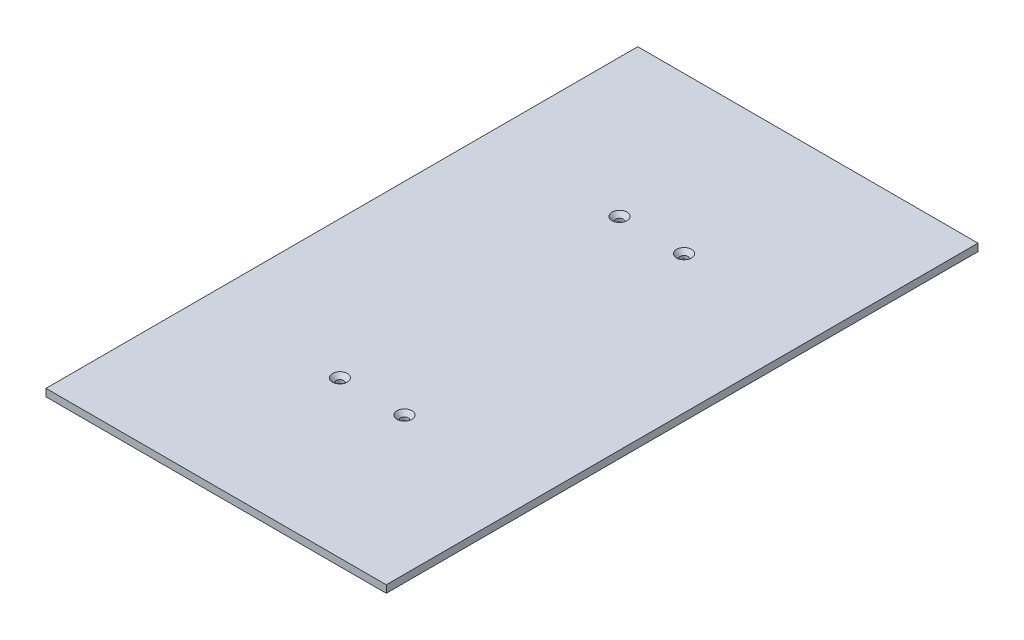
ISO-10303-21;
HEADER;
FILE_DESCRIPTION(('STEP AP214'),'2;1');
FILE_NAME('part.step','',(''),(''),'','','');
FILE_SCHEMA(('AUTOMOTIVE_DESIGN { 1 0 10303 214 1 1 1 1 }'));
ENDSEC;
DATA;
#1=APPLICATION_CONTEXT('core data for automotive mechanical design processes');
#2=APPLICATION_PROTOCOL_DEFINITION('international standard','automotive_design',2000,#1);
#3=PRODUCT_CONTEXT('',#1,'mechanical');
#4=PRODUCT('Part','Part','',(#3));
#5=PRODUCT_RELATED_PRODUCT_CATEGORY('part','',(#4));
#6=PRODUCT_DEFINITION_FORMATION('','',#4);
#7=PRODUCT_DEFINITION_CONTEXT('part definition',#1,'design');
#8=PRODUCT_DEFINITION('design','',#6,#7);
#9=PRODUCT_DEFINITION_SHAPE('','',#8);
#10=(LENGTH_UNIT() NAMED_UNIT(*) SI_UNIT(.MILLI.,.METRE.));
#11=(NAMED_UNIT(*) PLANE_ANGLE_UNIT() SI_UNIT($,.RADIAN.));
#12=(NAMED_UNIT(*) SI_UNIT($,.STERADIAN.) SOLID_ANGLE_UNIT());
#13=UNCERTAINTY_MEASURE_WITH_UNIT(LENGTH_MEASURE(1.E-05),#10,'distance_accuracy_value','');
#14=(GEOMETRIC_REPRESENTATION_CONTEXT(3) GLOBAL_UNCERTAINTY_ASSIGNED_CONTEXT((#13)) GLOBAL_UNIT_ASSIGNED_CONTEXT((#10,
#11,#12)) REPRESENTATION_CONTEXT('',''));
#15=CARTESIAN_POINT('',(0.,0.,0.));
#16=DIRECTION('',(0.,0.,1.));
#17=DIRECTION('',(1.,0.,0.));
#18=AXIS2_PLACEMENT_3D('',#15,#16,#17);
#19=CARTESIAN_POINT('',(0.92717059071068,6.35,22.9951434882447));
#20=DIRECTION('',(0.,0.,-1.));
#21=DIRECTION('',(-1.,0.,0.));
#22=AXIS2_PLACEMENT_3D('',#19,#20,#21);
#23=PLANE('',#22);
#24=DIRECTION('',(1.,0.,0.));
#25=VECTOR('',#24,1.);
#26=CARTESIAN_POINT('',(0.92717059071068,0.,22.9951434882447));
#27=LINE('',#26,#25);
#28=CARTESIAN_POINT('',(0.92717059071068,0.,22.9951434882447));
#29=VERTEX_POINT('',#28);
#30=CARTESIAN_POINT('',(293.027170590711,0.,22.9951434882446));
#31=VERTEX_POINT('',#30);
#32=EDGE_CURVE('E120',#29,#31,#27,.T.);
#33=ORIENTED_EDGE('',*,*,#32,.T.);
#34=DIRECTION('',(0.,-1.,0.));
#35=VECTOR('',#34,1.);
#36=CARTESIAN_POINT('',(293.027170590711,6.35,22.9951434882446));
#37=LINE('',#36,#35);
#38=CARTESIAN_POINT('',(293.027170590711,6.35,22.9951434882446));
#39=VERTEX_POINT('',#38);
#40=EDGE_CURVE('E11',#39,#31,#37,.T.);
#41=ORIENTED_EDGE('',*,*,#40,.F.);
#42=DIRECTION('',(1.,0.,0.));
#43=VECTOR('',#42,1.);
#44=CARTESIAN_POINT('',(0.92717059071068,6.35,22.9951434882447));
#45=LINE('',#44,#43);
#46=CARTESIAN_POINT('',(0.92717059071068,6.35,22.9951434882447));
#47=VERTEX_POINT('',#46);
#48=EDGE_CURVE('E100',#47,#39,#45,.T.);
#49=ORIENTED_EDGE('',*,*,#48,.F.);
#50=DIRECTION('',(0.,-1.,0.));
#51=VECTOR('',#50,1.);
#52=CARTESIAN_POINT('',(0.92717059071068,6.35,22.9951434882447));
#53=LINE('',#52,#51);
#54=EDGE_CURVE('E62',#47,#29,#53,.T.);
#55=ORIENTED_EDGE('',*,*,#54,.T.);
#56=EDGE_LOOP('',(#33,#41,#49,#55));
#57=FACE_BOUND('',#56,.T.);
#58=ADVANCED_FACE('F42',(#57),#23,.F.);
#59=CARTESIAN_POINT('',(293.027170590711,6.35,22.9951434882446));
#60=DIRECTION('',(-1.,0.,0.));
#61=DIRECTION('',(0.,0.,1.));
#62=AXIS2_PLACEMENT_3D('',#59,#60,#61);
#63=PLANE('',#62);
#64=DIRECTION('',(0.,0.,-1.));
#65=VECTOR('',#64,1.);
#66=CARTESIAN_POINT('',(293.027170590711,0.,22.9951434882446));
#67=LINE('',#66,#65);
#68=CARTESIAN_POINT('',(293.027170590711,0.,-485.004856511755));
#69=VERTEX_POINT('',#68);
#70=EDGE_CURVE('E106',#31,#69,#67,.T.);
#71=ORIENTED_EDGE('',*,*,#70,.T.);
#72=DIRECTION('',(0.,-1.,0.));
#73=VECTOR('',#72,1.);
#74=CARTESIAN_POINT('',(293.027170590711,6.35,-485.004856511755));
#75=LINE('',#74,#73);
#76=CARTESIAN_POINT('',(293.027170590711,6.35,-485.004856511755));
#77=VERTEX_POINT('',#76);
#78=EDGE_CURVE('E51',#77,#69,#75,.T.);
#79=ORIENTED_EDGE('',*,*,#78,.F.);
#80=DIRECTION('',(0.,0.,-1.));
#81=VECTOR('',#80,1.);
#82=CARTESIAN_POINT('',(293.027170590711,6.35,22.9951434882446));
#83=LINE('',#82,#81);
#84=EDGE_CURVE('E91',#39,#77,#83,.T.);
#85=ORIENTED_EDGE('',*,*,#84,.F.);
#86=ORIENTED_EDGE('',*,*,#40,.T.);
#87=EDGE_LOOP('',(#71,#79,#85,#86));
#88=FACE_BOUND('',#87,.T.);
#89=ADVANCED_FACE('F105',(#88),#63,.F.);
#90=CARTESIAN_POINT('',(0.92717059071068,6.35,-485.004856511755));
#91=DIRECTION('',(0.,0.,-1.));
#92=DIRECTION('',(-1.,0.,0.));
#93=AXIS2_PLACEMENT_3D('',#90,#91,#92);
#94=PLANE('',#93);
#95=DIRECTION('',(1.,0.,0.));
#96=VECTOR('',#95,1.);
#97=CARTESIAN_POINT('',(0.92717059071068,0.,-485.004856511755));
#98=LINE('',#97,#96);
#99=CARTESIAN_POINT('',(0.92717059071068,0.,-485.004856511755));
#100=VERTEX_POINT('',#99);
#101=EDGE_CURVE('E126',#100,#69,#98,.T.);
#102=ORIENTED_EDGE('',*,*,#101,.F.);
#103=DIRECTION('',(0.,-1.,0.));
#104=VECTOR('',#103,1.);
#105=CARTESIAN_POINT('',(0.92717059071068,6.35,-485.004856511755));
#106=LINE('',#105,#104);
#107=CARTESIAN_POINT('',(0.92717059071068,6.35,-485.004856511755));
#108=VERTEX_POINT('',#107);
#109=EDGE_CURVE('E79',#108,#100,#106,.T.);
#110=ORIENTED_EDGE('',*,*,#109,.F.);
#111=DIRECTION('',(1.,0.,0.));
#112=VECTOR('',#111,1.);
#113=CARTESIAN_POINT('',(0.92717059071068,6.35,-485.004856511755));
#114=LINE('',#113,#112);
#115=EDGE_CURVE('E99',#108,#77,#114,.T.);
#116=ORIENTED_EDGE('',*,*,#115,.T.);
#117=ORIENTED_EDGE('',*,*,#78,.T.);
#118=EDGE_LOOP('',(#102,#110,#116,#117));
#119=FACE_BOUND('',#118,.T.);
#120=ADVANCED_FACE('F110',(#119),#94,.T.);
#121=CARTESIAN_POINT('',(0.92717059071068,6.35,22.9951434882447));
#122=DIRECTION('',(-1.,0.,0.));
#123=DIRECTION('',(0.,0.,1.));
#124=AXIS2_PLACEMENT_3D('',#121,#122,#123);
#125=PLANE('',#124);
#126=DIRECTION('',(0.,0.,-1.));
#127=VECTOR('',#126,1.);
#128=CARTESIAN_POINT('',(0.92717059071068,0.,22.9951434882447));
#129=LINE('',#128,#127);
#130=EDGE_CURVE('E128',#29,#100,#129,.T.);
#131=ORIENTED_EDGE('',*,*,#130,.F.);
#132=ORIENTED_EDGE('',*,*,#54,.F.);
#133=DIRECTION('',(0.,0.,-1.));
#134=VECTOR('',#133,1.);
#135=CARTESIAN_POINT('',(0.92717059071068,6.35,22.9951434882447));
#136=LINE('',#135,#134);
#137=EDGE_CURVE('E112',#47,#108,#136,.T.);
#138=ORIENTED_EDGE('',*,*,#137,.T.);
#139=ORIENTED_EDGE('',*,*,#109,.T.);
#140=EDGE_LOOP('',(#131,#132,#138,#139));
#141=FACE_BOUND('',#140,.T.);
#142=ADVANCED_FACE('F204',(#141),#125,.T.);
#143=CARTESIAN_POINT('',(0.,6.35,0.));
#144=DIRECTION('',(0.,1.,0.));
#145=DIRECTION('',(0.,0.,1.));
#146=AXIS2_PLACEMENT_3D('',#143,#144,#145);
#147=PLANE('',#146);
#148=CARTESIAN_POINT('',(119.277170590711,6.35,-351.004856511755));
#149=DIRECTION('',(0.,1.,0.));
#150=DIRECTION('',(0.,0.,1.));
#151=AXIS2_PLACEMENT_3D('',#148,#149,#150);
#152=CIRCLE('',#151,6.4389);
#153=CARTESIAN_POINT('',(119.277170590711,6.35,-344.565956511755));
#154=VERTEX_POINT('',#153);
#155=EDGE_CURVE('E167',#154,#154,#152,.T.);
#156=ORIENTED_EDGE('',*,*,#155,.F.);
#157=EDGE_LOOP('',(#156));
#158=FACE_BOUND('',#157,.T.);
#159=CARTESIAN_POINT('',(174.677170590711,6.35,-351.004856511755));
#160=DIRECTION('',(0.,1.,0.));
#161=DIRECTION('',(0.,0.,1.));
#162=AXIS2_PLACEMENT_3D('',#159,#160,#161);
#163=CIRCLE('',#162,6.4389);
#164=CARTESIAN_POINT('',(174.677170590711,6.35,-344.565956511755));
#165=VERTEX_POINT('',#164);
#166=EDGE_CURVE('E172',#165,#165,#163,.T.);
#167=ORIENTED_EDGE('',*,*,#166,.F.);
#168=EDGE_LOOP('',(#167));
#169=FACE_BOUND('',#168,.T.);
#170=CARTESIAN_POINT('',(174.677170590711,6.35,-111.004856511755));
#171=DIRECTION('',(0.,1.,0.));
#172=DIRECTION('',(0.,0.,1.));
#173=AXIS2_PLACEMENT_3D('',#170,#171,#172);
#174=CIRCLE('',#173,6.4389);
#175=CARTESIAN_POINT('',(174.677170590711,6.35,-104.565956511755));
#176=VERTEX_POINT('',#175);
#177=EDGE_CURVE('E151',#176,#176,#174,.T.);
#178=ORIENTED_EDGE('',*,*,#177,.F.);
#179=EDGE_LOOP('',(#178));
#180=FACE_BOUND('',#179,.T.);
#181=CARTESIAN_POINT('',(119.277170590711,6.35,-111.004856511755));
#182=DIRECTION('',(0.,1.,0.));
#183=DIRECTION('',(0.,0.,1.));
#184=AXIS2_PLACEMENT_3D('',#181,#182,#183);
#185=CIRCLE('',#184,6.4389);
#186=CARTESIAN_POINT('',(119.277170590711,6.35,-104.565956511755));
#187=VERTEX_POINT('',#186);
#188=EDGE_CURVE('E136',#187,#187,#185,.T.);
#189=ORIENTED_EDGE('',*,*,#188,.F.);
#190=EDGE_LOOP('',(#189));
#191=FACE_BOUND('',#190,.T.);
#192=ORIENTED_EDGE('',*,*,#48,.T.);
#193=ORIENTED_EDGE('',*,*,#84,.T.);
#194=ORIENTED_EDGE('',*,*,#115,.F.);
#195=ORIENTED_EDGE('',*,*,#137,.F.);
#196=EDGE_LOOP('',(#192,#193,#194,#195));
#197=FACE_BOUND('',#196,.T.);
#198=ADVANCED_FACE('F96',(#158,#169,#180,#191,#197),#147,.T.);
#199=CARTESIAN_POINT('',(0.,0.,0.));
#200=DIRECTION('',(0.,1.,0.));
#201=DIRECTION('',(0.,0.,1.));
#202=AXIS2_PLACEMENT_3D('',#199,#200,#201);
#203=PLANE('',#202);
#204=CARTESIAN_POINT('',(119.277170590711,0.,-351.004856511755));
#205=DIRECTION('',(0.,1.,0.));
#206=DIRECTION('',(0.,0.,1.));
#207=AXIS2_PLACEMENT_3D('',#204,#205,#206);
#208=CIRCLE('',#207,3.2639);
#209=CARTESIAN_POINT('',(119.277170590711,0.,-347.740956511755));
#210=VERTEX_POINT('',#209);
#211=EDGE_CURVE('E175',#210,#210,#208,.T.);
#212=ORIENTED_EDGE('',*,*,#211,.T.);
#213=EDGE_LOOP('',(#212));
#214=FACE_BOUND('',#213,.T.);
#215=CARTESIAN_POINT('',(174.677170590711,0.,-351.004856511755));
#216=DIRECTION('',(0.,1.,0.));
#217=DIRECTION('',(0.,0.,1.));
#218=AXIS2_PLACEMENT_3D('',#215,#216,#217);
#219=CIRCLE('',#218,3.26389999999999);
#220=CARTESIAN_POINT('',(174.677170590711,0.,-347.740956511755));
#221=VERTEX_POINT('',#220);
#222=EDGE_CURVE('E157',#221,#221,#219,.T.);
#223=ORIENTED_EDGE('',*,*,#222,.T.);
#224=EDGE_LOOP('',(#223));
#225=FACE_BOUND('',#224,.T.);
#226=CARTESIAN_POINT('',(174.677170590711,0.,-111.004856511755));
#227=DIRECTION('',(0.,1.,0.));
#228=DIRECTION('',(0.,0.,1.));
#229=AXIS2_PLACEMENT_3D('',#226,#227,#228);
#230=CIRCLE('',#229,3.26389999999999);
#231=CARTESIAN_POINT('',(174.677170590711,0.,-107.740956511755));
#232=VERTEX_POINT('',#231);
#233=EDGE_CURVE('E140',#232,#232,#230,.T.);
#234=ORIENTED_EDGE('',*,*,#233,.T.);
#235=EDGE_LOOP('',(#234));
#236=FACE_BOUND('',#235,.T.);
#237=CARTESIAN_POINT('',(119.277170590711,0.,-111.004856511755));
#238=DIRECTION('',(0.,1.,0.));
#239=DIRECTION('',(0.,0.,1.));
#240=AXIS2_PLACEMENT_3D('',#237,#238,#239);
#241=CIRCLE('',#240,3.2639);
#242=CARTESIAN_POINT('',(119.277170590711,0.,-107.740956511755));
#243=VERTEX_POINT('',#242);
#244=EDGE_CURVE('E123',#243,#243,#241,.T.);
#245=ORIENTED_EDGE('',*,*,#244,.T.);
#246=EDGE_LOOP('',(#245));
#247=FACE_BOUND('',#246,.T.);
#248=ORIENTED_EDGE('',*,*,#32,.F.);
#249=ORIENTED_EDGE('',*,*,#130,.T.);
#250=ORIENTED_EDGE('',*,*,#101,.T.);
#251=ORIENTED_EDGE('',*,*,#70,.F.);
#252=EDGE_LOOP('',(#248,#249,#250,#251));
#253=FACE_BOUND('',#252,.T.);
#254=ADVANCED_FACE('F186',(#214,#225,#236,#247,#253),#203,.F.);
#255=CARTESIAN_POINT('',(119.277170590711,6.35,-111.004856511755));
#256=DIRECTION('',(0.,1.,0.));
#257=DIRECTION('',(0.,0.,1.));
#258=AXIS2_PLACEMENT_3D('',#255,#256,#257);
#259=CYLINDRICAL_SURFACE('',#258,3.2639);
#260=ORIENTED_EDGE('',*,*,#244,.F.);
#261=EDGE_LOOP('',(#260));
#262=FACE_BOUND('',#261,.T.);
#263=CARTESIAN_POINT('',(119.277170590711,2.69758030707329,-111.004856511755));
#264=DIRECTION('',(0.,1.,0.));
#265=DIRECTION('',(0.,0.,1.));
#266=AXIS2_PLACEMENT_3D('',#263,#264,#265);
#267=CIRCLE('',#266,3.2639);
#268=CARTESIAN_POINT('',(119.277170590711,2.69758030707329,-107.740956511755));
#269=VERTEX_POINT('',#268);
#270=EDGE_CURVE('E139',#269,#269,#267,.T.);
#271=ORIENTED_EDGE('',*,*,#270,.T.);
#272=EDGE_LOOP('',(#271));
#273=FACE_BOUND('',#272,.T.);
#274=ADVANCED_FACE('F214',(#262,#273),#259,.F.);
#275=CARTESIAN_POINT('',(119.277170590711,6.35,-111.004856511755));
#276=DIRECTION('',(0.,1.,0.));
#277=DIRECTION('',(0.,0.,1.));
#278=AXIS2_PLACEMENT_3D('',#275,#276,#277);
#279=CONICAL_SURFACE('',#278,6.4389,0.715584993317674);
#280=ORIENTED_EDGE('',*,*,#270,.F.);
#281=EDGE_LOOP('',(#280));
#282=FACE_BOUND('',#281,.T.);
#283=ORIENTED_EDGE('',*,*,#188,.T.);
#284=EDGE_LOOP('',(#283));
#285=FACE_BOUND('',#284,.T.);
#286=ADVANCED_FACE('F211',(#282,#285),#279,.F.);
#287=CARTESIAN_POINT('',(174.677170590711,6.35,-111.004856511755));
#288=DIRECTION('',(0.,1.,0.));
#289=DIRECTION('',(0.,0.,1.));
#290=AXIS2_PLACEMENT_3D('',#287,#288,#289);
#291=CYLINDRICAL_SURFACE('',#290,3.26389999999999);
#292=ORIENTED_EDGE('',*,*,#233,.F.);
#293=EDGE_LOOP('',(#292));
#294=FACE_BOUND('',#293,.T.);
#295=CARTESIAN_POINT('',(174.677170590711,2.69758030707329,-111.004856511755));
#296=DIRECTION('',(0.,1.,0.));
#297=DIRECTION('',(0.,0.,1.));
#298=AXIS2_PLACEMENT_3D('',#295,#296,#297);
#299=CIRCLE('',#298,3.26389999999999);
#300=CARTESIAN_POINT('',(174.677170590711,2.69758030707329,-107.740956511755));
#301=VERTEX_POINT('',#300);
#302=EDGE_CURVE('E148',#301,#301,#299,.T.);
#303=ORIENTED_EDGE('',*,*,#302,.T.);
#304=EDGE_LOOP('',(#303));
#305=FACE_BOUND('',#304,.T.);
#306=ADVANCED_FACE('F213',(#294,#305),#291,.F.);
#307=CARTESIAN_POINT('',(174.677170590711,6.35,-111.004856511755));
#308=DIRECTION('',(0.,1.,0.));
#309=DIRECTION('',(0.,0.,1.));
#310=AXIS2_PLACEMENT_3D('',#307,#308,#309);
#311=CONICAL_SURFACE('',#310,6.4389,0.715584993317677);
#312=ORIENTED_EDGE('',*,*,#302,.F.);
#313=EDGE_LOOP('',(#312));
#314=FACE_BOUND('',#313,.T.);
#315=ORIENTED_EDGE('',*,*,#177,.T.);
#316=EDGE_LOOP('',(#315));
#317=FACE_BOUND('',#316,.T.);
#318=ADVANCED_FACE('F221',(#314,#317),#311,.F.);
#319=CARTESIAN_POINT('',(174.677170590711,6.35,-351.004856511755));
#320=DIRECTION('',(0.,1.,0.));
#321=DIRECTION('',(0.,0.,1.));
#322=AXIS2_PLACEMENT_3D('',#319,#320,#321);
#323=CYLINDRICAL_SURFACE('',#322,3.26389999999999);
#324=ORIENTED_EDGE('',*,*,#222,.F.);
#325=EDGE_LOOP('',(#324));
#326=FACE_BOUND('',#325,.T.);
#327=CARTESIAN_POINT('',(174.677170590711,2.69758030707329,-351.004856511755));
#328=DIRECTION('',(0.,1.,0.));
#329=DIRECTION('',(0.,0.,1.));
#330=AXIS2_PLACEMENT_3D('',#327,#328,#329);
#331=CIRCLE('',#330,3.26389999999999);
#332=CARTESIAN_POINT('',(174.677170590711,2.69758030707329,-347.740956511755));
#333=VERTEX_POINT('',#332);
#334=EDGE_CURVE('E163',#333,#333,#331,.T.);
#335=ORIENTED_EDGE('',*,*,#334,.T.);
#336=EDGE_LOOP('',(#335));
#337=FACE_BOUND('',#336,.T.);
#338=ADVANCED_FACE('F271',(#326,#337),#323,.F.);
#339=CARTESIAN_POINT('',(174.677170590711,6.35,-351.004856511755));
#340=DIRECTION('',(0.,1.,0.));
#341=DIRECTION('',(0.,0.,1.));
#342=AXIS2_PLACEMENT_3D('',#339,#340,#341);
#343=CONICAL_SURFACE('',#342,6.4389,0.715584993317677);
#344=ORIENTED_EDGE('',*,*,#334,.F.);
#345=EDGE_LOOP('',(#344));
#346=FACE_BOUND('',#345,.T.);
#347=ORIENTED_EDGE('',*,*,#166,.T.);
#348=EDGE_LOOP('',(#347));
#349=FACE_BOUND('',#348,.T.);
#350=ADVANCED_FACE('F193',(#346,#349),#343,.F.);
#351=CARTESIAN_POINT('',(119.277170590711,6.35,-351.004856511755));
#352=DIRECTION('',(0.,1.,0.));
#353=DIRECTION('',(0.,0.,1.));
#354=AXIS2_PLACEMENT_3D('',#351,#352,#353);
#355=CYLINDRICAL_SURFACE('',#354,3.2639);
#356=ORIENTED_EDGE('',*,*,#211,.F.);
#357=EDGE_LOOP('',(#356));
#358=FACE_BOUND('',#357,.T.);
#359=CARTESIAN_POINT('',(119.277170590711,2.69758030707329,-351.004856511755));
#360=DIRECTION('',(0.,1.,0.));
#361=DIRECTION('',(0.,0.,1.));
#362=AXIS2_PLACEMENT_3D('',#359,#360,#361);
#363=CIRCLE('',#362,3.2639);
#364=CARTESIAN_POINT('',(119.277170590711,2.69758030707329,-347.740956511755));
#365=VERTEX_POINT('',#364);
#366=EDGE_CURVE('E170',#365,#365,#363,.T.);
#367=ORIENTED_EDGE('',*,*,#366,.T.);
#368=EDGE_LOOP('',(#367));
#369=FACE_BOUND('',#368,.T.);
#370=ADVANCED_FACE('F189',(#358,#369),#355,.F.);
#371=CARTESIAN_POINT('',(119.277170590711,6.35,-351.004856511755));
#372=DIRECTION('',(0.,1.,0.));
#373=DIRECTION('',(0.,0.,1.));
#374=AXIS2_PLACEMENT_3D('',#371,#372,#373);
#375=CONICAL_SURFACE('',#374,6.4389,0.715584993317674);
#376=ORIENTED_EDGE('',*,*,#366,.F.);
#377=EDGE_LOOP('',(#376));
#378=FACE_BOUND('',#377,.T.);
#379=ORIENTED_EDGE('',*,*,#155,.T.);
#380=EDGE_LOOP('',(#379));
#381=FACE_BOUND('',#380,.T.);
#382=ADVANCED_FACE('F192',(#378,#381),#375,.F.);
#383=CLOSED_SHELL('',(#58,#89,#120,#142,#198,#254,#274,#286,#306,#318,#338,#350,#370,#382));
#384=MANIFOLD_SOLID_BREP('B2',#383);
#385=ADVANCED_BREP_SHAPE_REPRESENTATION('',(#18,#384),#14);
#386=SHAPE_DEFINITION_REPRESENTATION(#9,#385);
ENDSEC;
END-ISO-10303-21;
